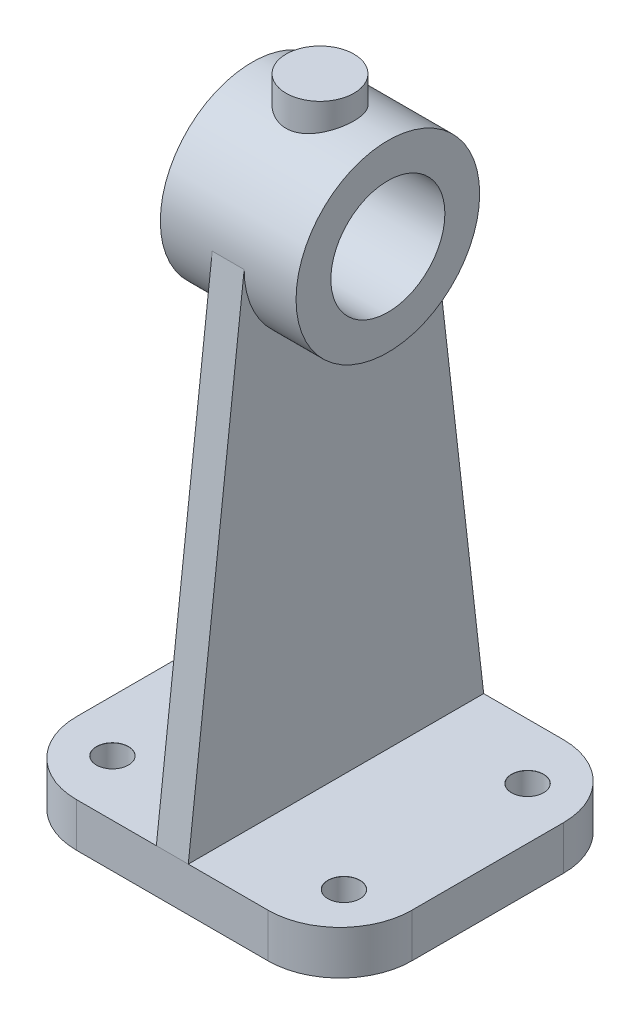
ISO-10303-21;
HEADER;
FILE_DESCRIPTION(('STEP AP214'),'2;1');
FILE_NAME('part.step','',(''),(''),'','','');
FILE_SCHEMA(('AUTOMOTIVE_DESIGN { 1 0 10303 214 1 1 1 1 }'));
ENDSEC;
DATA;
#1=APPLICATION_CONTEXT('core data for automotive mechanical design processes');
#2=APPLICATION_PROTOCOL_DEFINITION('international standard','automotive_design',2000,#1);
#3=PRODUCT_CONTEXT('',#1,'mechanical');
#4=PRODUCT('Part','Part','',(#3));
#5=PRODUCT_RELATED_PRODUCT_CATEGORY('part','',(#4));
#6=PRODUCT_DEFINITION_FORMATION('','',#4);
#7=PRODUCT_DEFINITION_CONTEXT('part definition',#1,'design');
#8=PRODUCT_DEFINITION('design','',#6,#7);
#9=PRODUCT_DEFINITION_SHAPE('','',#8);
#10=(LENGTH_UNIT() NAMED_UNIT(*) SI_UNIT(.MILLI.,.METRE.));
#11=(NAMED_UNIT(*) PLANE_ANGLE_UNIT() SI_UNIT($,.RADIAN.));
#12=(NAMED_UNIT(*) SI_UNIT($,.STERADIAN.) SOLID_ANGLE_UNIT());
#13=UNCERTAINTY_MEASURE_WITH_UNIT(LENGTH_MEASURE(1.E-05),#10,'distance_accuracy_value','');
#14=(GEOMETRIC_REPRESENTATION_CONTEXT(3) GLOBAL_UNCERTAINTY_ASSIGNED_CONTEXT((#13)) GLOBAL_UNIT_ASSIGNED_CONTEXT((#10,
#11,#12)) REPRESENTATION_CONTEXT('',''));
#15=CARTESIAN_POINT('',(0.,0.,0.));
#16=DIRECTION('',(0.,0.,1.));
#17=DIRECTION('',(1.,0.,0.));
#18=AXIS2_PLACEMENT_3D('',#15,#16,#17);
#19=CARTESIAN_POINT('',(17.,133.,0.));
#20=DIRECTION('',(-1.,0.,0.));
#21=DIRECTION('',(0.,0.,1.));
#22=AXIS2_PLACEMENT_3D('',#19,#20,#21);
#23=CYLINDRICAL_SURFACE('',#22,23.);
#24=CARTESIAN_POINT('',(4.,133.,0.));
#25=DIRECTION('',(1.,0.,0.));
#26=DIRECTION('',(0.,0.,-1.));
#27=AXIS2_PLACEMENT_3D('',#24,#25,#26);
#28=CIRCLE('',#27,23.);
#29=CARTESIAN_POINT('',(4.,133.,23.));
#30=VERTEX_POINT('',#29);
#31=CARTESIAN_POINT('',(4.,133.,-23.));
#32=VERTEX_POINT('',#31);
#33=EDGE_CURVE('E171',#30,#32,#28,.T.);
#34=ORIENTED_EDGE('',*,*,#33,.T.);
#35=DIRECTION('',(-1.,0.,0.));
#36=VECTOR('',#35,1.);
#37=CARTESIAN_POINT('',(4.,133.,-23.));
#38=LINE('',#37,#36);
#39=CARTESIAN_POINT('',(-4.,133.,-23.));
#40=VERTEX_POINT('',#39);
#41=EDGE_CURVE('E146',#32,#40,#38,.T.);
#42=ORIENTED_EDGE('',*,*,#41,.T.);
#43=CARTESIAN_POINT('',(-4.,133.,0.));
#44=DIRECTION('',(1.,0.,0.));
#45=DIRECTION('',(0.,0.,-1.));
#46=AXIS2_PLACEMENT_3D('',#43,#44,#45);
#47=CIRCLE('',#46,23.);
#48=CARTESIAN_POINT('',(-4.,133.,23.));
#49=VERTEX_POINT('',#48);
#50=EDGE_CURVE('E140',#49,#40,#47,.T.);
#51=ORIENTED_EDGE('',*,*,#50,.F.);
#52=DIRECTION('',(-1.,0.,0.));
#53=VECTOR('',#52,1.);
#54=CARTESIAN_POINT('',(4.,133.,23.));
#55=LINE('',#54,#53);
#56=EDGE_CURVE('E143',#30,#49,#55,.T.);
#57=ORIENTED_EDGE('',*,*,#56,.F.);
#58=EDGE_LOOP('',(#34,#42,#51,#57));
#59=FACE_BOUND('',#58,.T.);
#60=CARTESIAN_POINT('',(17.,133.,0.));
#61=DIRECTION('',(1.,0.,0.));
#62=DIRECTION('',(0.,0.,-1.));
#63=AXIS2_PLACEMENT_3D('',#60,#61,#62);
#64=CIRCLE('',#63,23.);
#65=CARTESIAN_POINT('',(17.,133.,-23.));
#66=VERTEX_POINT('',#65);
#67=EDGE_CURVE('E152',#66,#66,#64,.T.);
#68=ORIENTED_EDGE('',*,*,#67,.F.);
#69=EDGE_LOOP('',(#68));
#70=FACE_BOUND('',#69,.T.);
#71=CARTESIAN_POINT('',(-17.,133.,0.));
#72=DIRECTION('',(1.,0.,0.));
#73=DIRECTION('',(0.,0.,-1.));
#74=AXIS2_PLACEMENT_3D('',#71,#72,#73);
#75=CIRCLE('',#74,23.);
#76=CARTESIAN_POINT('',(-17.,133.,-23.));
#77=VERTEX_POINT('',#76);
#78=EDGE_CURVE('E302',#77,#77,#75,.T.);
#79=ORIENTED_EDGE('',*,*,#78,.T.);
#80=EDGE_LOOP('',(#79));
#81=FACE_BOUND('',#80,.T.);
#82=CARTESIAN_POINT('',(0.,154.371710273163,8.5));
#83=CARTESIAN_POINT('',(0.229775915866107,154.371709414959,8.50000095938498));
#84=CARTESIAN_POINT('',(0.459538674025617,154.375425831429,8.49067536109354));
#85=CARTESIAN_POINT('',(0.917322815176592,154.390164864719,8.45347561910277));
#86=CARTESIAN_POINT('',(1.14534421533403,154.401187409421,8.42560165848898));
#87=CARTESIAN_POINT('',(1.59793548188344,154.430174739107,8.35159764599628));
#88=CARTESIAN_POINT('',(1.82250554240052,154.44813913214,8.30546862482995));
#89=CARTESIAN_POINT('',(2.26662628933497,154.490433260763,8.19541016579389));
#90=CARTESIAN_POINT('',(2.48617684217598,154.514763165534,8.13148025481204));
#91=CARTESIAN_POINT('',(2.91823342636201,154.568965202636,7.98659500172839));
#92=CARTESIAN_POINT('',(3.13075615691292,154.598822887724,7.90568396897091));
#93=CARTESIAN_POINT('',(3.54811082311615,154.663253624277,7.72738149726256));
#94=CARTESIAN_POINT('',(3.75294004399929,154.69782832064,7.6299843064564));
#95=CARTESIAN_POINT('',(4.15362456302796,154.770709312278,7.41947535547076));
#96=CARTESIAN_POINT('',(4.34948090021479,154.809015173878,7.30636542094188));
#97=CARTESIAN_POINT('',(4.73124281765567,154.888347941446,7.06515004434444));
#98=CARTESIAN_POINT('',(4.91714476575472,154.929375828565,6.93703918234816));
#99=CARTESIAN_POINT('',(5.28583104538984,155.014914542455,6.66073201387198));
#100=CARTESIAN_POINT('',(5.46812403414775,155.059499222677,6.51190258518545));
#101=CARTESIAN_POINT('',(5.81967367744369,155.149259832301,6.19973078045039));
#102=CARTESIAN_POINT('',(5.98893001636298,155.194435775988,6.03638805323933));
#103=CARTESIAN_POINT('',(6.31346765651576,155.284199415527,5.69608873151632));
#104=CARTESIAN_POINT('',(6.46874367053101,155.328786883429,5.51912703298387));
#105=CARTESIAN_POINT('',(6.7642254840159,155.416173421023,5.15272975771495));
#106=CARTESIAN_POINT('',(6.90443649911829,155.458973106504,4.96329853490196));
#107=CARTESIAN_POINT('',(7.17332643701867,155.543064528384,4.56647860581622));
#108=CARTESIAN_POINT('',(7.3014636595574,155.584258129724,4.35870141242079));
#109=CARTESIAN_POINT('',(7.53963798598468,155.662380397981,3.93236015761444));
#110=CARTESIAN_POINT('',(7.64968233954887,155.699310771367,3.71380046253266));
#111=CARTESIAN_POINT('',(7.85077223080252,155.767865212504,3.26731034594423));
#112=CARTESIAN_POINT('',(7.94181863139777,155.799489521249,3.03938035060902));
#113=CARTESIAN_POINT('',(8.10404505009427,155.856503965761,2.57580074316979));
#114=CARTESIAN_POINT('',(8.1752261334322,155.881894435795,2.34015154574951));
#115=CARTESIAN_POINT('',(8.29443151750516,155.924760291081,1.87298072998978));
#116=CARTESIAN_POINT('',(8.34330291851102,155.942523347641,1.64170151041939));
#117=CARTESIAN_POINT('',(8.42164927965232,155.971130636843,1.1754562405086));
#118=CARTESIAN_POINT('',(8.45112473549612,155.981975046308,0.940490284548438));
#119=CARTESIAN_POINT('',(8.4903632098741,155.996433079812,0.468759942126706));
#120=CARTESIAN_POINT('',(8.50013155339173,156.000048657125,0.231996058837068));
#121=CARTESIAN_POINT('',(8.49986578119347,155.999950357832,-0.241515741267165));
#122=CARTESIAN_POINT('',(8.4898322444726,155.996236695528,-0.478263658346189));
#123=CARTESIAN_POINT('',(8.45103594608556,155.981943058481,-0.938463189494859));
#124=CARTESIAN_POINT('',(8.42320179379548,155.971703603176,-1.16200442573995));
#125=CARTESIAN_POINT('',(8.34995470075081,155.94494674058,-1.6058866875009));
#126=CARTESIAN_POINT('',(8.30453557702733,155.928427125189,-1.82622655909655));
#127=CARTESIAN_POINT('',(8.1965547647133,155.889538592229,-2.26205150627969));
#128=CARTESIAN_POINT('',(8.13399883676114,155.867171640392,-2.47753818699966));
#129=CARTESIAN_POINT('',(7.99225429646033,155.817136826727,-2.90242091066315));
#130=CARTESIAN_POINT('',(7.91305938446155,155.789466957522,-3.11181461247401));
#131=CARTESIAN_POINT('',(7.73746806545198,155.729089788099,-3.52603145185157));
#132=CARTESIAN_POINT('',(7.64084618487887,155.696317337405,-3.73074943857737));
#133=CARTESIAN_POINT('',(7.43187652042364,155.626822114239,-4.13137688051776));
#134=CARTESIAN_POINT('',(7.319523372949,155.590097995435,-4.32728330119288));
#135=CARTESIAN_POINT('',(7.079891753328,155.513595378714,-4.70913435312721));
#136=CARTESIAN_POINT('',(6.95261202780597,155.473816624399,-4.89507814591801));
#137=CARTESIAN_POINT('',(6.68394704833021,155.392158718158,-5.25599354940185));
#138=CARTESIAN_POINT('',(6.54256115994075,155.350279471803,-5.4309646660133));
#139=CARTESIAN_POINT('',(6.23804757903824,155.262990912065,-5.77868318946364));
#140=CARTESIAN_POINT('',(6.07413887835063,155.217516694019,-5.95073104648789));
#141=CARTESIAN_POINT('',(5.73255727742082,155.126570556833,-6.28045556351158));
#142=CARTESIAN_POINT('',(5.55488855476436,155.081098641156,-6.43813655393984));
#143=CARTESIAN_POINT('',(5.18667841878683,154.99135603358,-6.73830981719282));
#144=CARTESIAN_POINT('',(4.99612930229291,154.947086083102,-6.8807928671531));
#145=CARTESIAN_POINT('',(4.60344705997251,154.861039491115,-7.14946492356397));
#146=CARTESIAN_POINT('',(4.40131849026021,154.819261881986,-7.27566027594099));
#147=CARTESIAN_POINT('',(3.98214497064019,154.738543859382,-7.51344268919522));
#148=CARTESIAN_POINT('',(3.76487257665985,154.699683888351,-7.62465677147438));
#149=CARTESIAN_POINT('',(3.32094242834558,154.627083522516,-7.82821434456089));
#150=CARTESIAN_POINT('',(3.09428870581085,154.593340956906,-7.9205658426903));
#151=CARTESIAN_POINT('',(2.63314898815616,154.532098664392,-8.08557227573551));
#152=CARTESIAN_POINT('',(2.39866471216818,154.504597577428,-8.15823150240587));
#153=CARTESIAN_POINT('',(1.92360019814951,154.456803400177,-8.28311959920727));
#154=CARTESIAN_POINT('',(1.68302036518413,154.436509832271,-8.33534982312593));
#155=CARTESIAN_POINT('',(1.21079296303975,154.404755163416,-8.41654618212832));
#156=CARTESIAN_POINT('',(0.979362462448499,154.392877112745,-8.44661407882));
#157=CARTESIAN_POINT('',(0.514551332068469,154.376642155406,-8.48761816167527));
#158=CARTESIAN_POINT('',(0.281170772775786,154.372284978025,-8.49855503645895));
#159=CARTESIAN_POINT('',(-0.185664691933814,154.371242267751,-8.50117668465825));
#160=CARTESIAN_POINT('',(-0.41911957120935,154.374555113495,-8.49286552690541));
#161=CARTESIAN_POINT('',(-0.884321689379734,154.388734740396,-8.45709143116048));
#162=CARTESIAN_POINT('',(-1.11606895948026,154.399601383163,-8.42962884403246));
#163=CARTESIAN_POINT('',(-1.56552390983119,154.427852795569,-8.35754402620752));
#164=CARTESIAN_POINT('',(-1.78338810549485,154.444915848886,-8.3137663398075));
#165=CARTESIAN_POINT('',(-2.21457286403258,154.48507008072,-8.20943880000196));
#166=CARTESIAN_POINT('',(-2.42789180632777,154.508163371628,-8.14888306879957));
#167=CARTESIAN_POINT('',(-2.84851561930423,154.559695587502,-8.0115477633183));
#168=CARTESIAN_POINT('',(-3.05582182178693,154.588133318094,-7.93477181345912));
#169=CARTESIAN_POINT('',(-3.46333062998914,154.649574168315,-7.7655673969148));
#170=CARTESIAN_POINT('',(-3.66353043954713,154.682579060509,-7.67313284981487));
#171=CARTESIAN_POINT('',(-4.06277303719396,154.753531676179,-7.46966406893017));
#172=CARTESIAN_POINT('',(-4.26150934580644,154.791615444177,-7.35807595312031));
#173=CARTESIAN_POINT('',(-4.64905483872566,154.870704169791,-7.11955665470747));
#174=CARTESIAN_POINT('',(-4.83785955241217,154.911710423706,-6.9926186458761));
#175=CARTESIAN_POINT('',(-5.20444999067684,154.995555272972,-6.72423299876731));
#176=CARTESIAN_POINT('',(-5.3822347107114,155.038394034768,-6.58278404083438));
#177=CARTESIAN_POINT('',(-5.72581954464736,155.124813155634,-6.28621478037363));
#178=CARTESIAN_POINT('',(-5.89161928369005,155.168393537846,-6.13109405056519));
#179=CARTESIAN_POINT('',(-6.22013942610391,155.257889330419,-5.79809264750484));
#180=CARTESIAN_POINT('',(-6.38204266613803,155.303783424399,-5.61939883538075));
#181=CARTESIAN_POINT('',(-6.69021494941231,155.393911361465,-5.24872339613047));
#182=CARTESIAN_POINT('',(-6.83648948454091,155.438145784186,-5.05674647598532));
#183=CARTESIAN_POINT('',(-7.11251137871586,155.523778385911,-4.66052551394389));
#184=CARTESIAN_POINT('',(-7.24225160407136,155.565175337159,-4.45627623271158));
#185=CARTESIAN_POINT('',(-7.48408487453723,155.643949694014,-4.03695718762298));
#186=CARTESIAN_POINT('',(-7.5961854631709,155.68132881565,-3.82189210131268));
#187=CARTESIAN_POINT('',(-7.80147534206775,155.750905976093,-3.38310911880484));
#188=CARTESIAN_POINT('',(-7.89473408625512,155.783122948952,-3.15942675918575));
#189=CARTESIAN_POINT('',(-8.06201027077814,155.841625713104,-2.7042162657834));
#190=CARTESIAN_POINT('',(-8.13602762465575,155.867911477744,-2.47268809675157));
#191=CARTESIAN_POINT('',(-8.26405820246302,155.913774983212,-2.00360332369814));
#192=CARTESIAN_POINT('',(-8.31807893239402,155.933355240835,-1.76604901751887));
#193=CARTESIAN_POINT('',(-8.40557715187142,155.965235944794,-1.28670828960512));
#194=CARTESIAN_POINT('',(-8.43905578083266,155.977536794898,-1.04492210336689));
#195=CARTESIAN_POINT('',(-8.48379241371634,155.99400645446,-0.572916057044091));
#196=CARTESIAN_POINT('',(-8.49620494161708,155.998597625538,-0.342819637583203));
#197=CARTESIAN_POINT('',(-8.50230378039103,156.000851270861,0.117650305227534));
#198=CARTESIAN_POINT('',(-8.49599084468428,155.998514023871,0.348023817055761));
#199=CARTESIAN_POINT('',(-8.46470579584663,155.9869753237,0.80729841868431));
#200=CARTESIAN_POINT('',(-8.43973572050229,155.977774620165,1.03619966653584));
#201=CARTESIAN_POINT('',(-8.37138939021792,155.952759096398,1.4908683008366));
#202=CARTESIAN_POINT('',(-8.32801313817222,155.936944277205,1.71663568777863));
#203=CARTESIAN_POINT('',(-8.22450170234715,155.899566781087,2.15819089386682));
#204=CARTESIAN_POINT('',(-8.16478240073736,155.878147253949,2.37408861458024));
#205=CARTESIAN_POINT('',(-8.028687773494,155.8299316412,2.80003196030865));
#206=CARTESIAN_POINT('',(-7.95230653515589,155.80313364724,3.01007547796714));
#207=CARTESIAN_POINT('',(-7.78354232485212,155.744829417638,3.42289122948837));
#208=CARTESIAN_POINT('',(-7.69116304654747,155.713324269024,3.62566512876065));
#209=CARTESIAN_POINT('',(-7.49104766512324,155.646344183195,4.02289538396114));
#210=CARTESIAN_POINT('',(-7.38330563110801,155.610867713968,4.21734848972158));
#211=CARTESIAN_POINT('',(-7.1485058378333,155.535267499221,4.60458657673742));
#212=CARTESIAN_POINT('',(-7.02083669622064,155.495012759824,4.79697536056817));
#213=CARTESIAN_POINT('',(-6.75049854232737,155.412109996516,5.17048799587724));
#214=CARTESIAN_POINT('',(-6.60782277064222,155.369460898186,5.35160671203789));
#215=CARTESIAN_POINT('',(-6.30839773850786,155.282848697676,5.70150360860232));
#216=CARTESIAN_POINT('',(-6.1516471115846,155.238885468189,5.87028058790154));
#217=CARTESIAN_POINT('',(-5.82500149242498,155.15075422157,6.19453968495063));
#218=CARTESIAN_POINT('',(-5.65510621943205,155.106586200084,6.35002151858));
#219=CARTESIAN_POINT('',(-5.29410353924634,155.016934954024,6.65439865345492));
#220=CARTESIAN_POINT('',(-5.10235550886028,154.971500117912,6.80254953768143));
#221=CARTESIAN_POINT('',(-4.70662105897265,154.882986782527,7.08211749826815));
#222=CARTESIAN_POINT('',(-4.50263920924614,154.839907414755,7.21354076642744));
#223=CARTESIAN_POINT('',(-4.08351802059839,154.757364242979,7.45881092083367));
#224=CARTESIAN_POINT('',(-3.86837308256336,154.717902281368,7.57264887064381));
#225=CARTESIAN_POINT('',(-3.42850791453102,154.643883570653,7.78168366862904));
#226=CARTESIAN_POINT('',(-3.20379184973344,154.60932471559,7.87688852671111));
#227=CARTESIAN_POINT('',(-2.73894885169079,154.545236067988,8.05056867429209));
#228=CARTESIAN_POINT('',(-2.49855903632515,154.515901528118,8.12841448682996));
#229=CARTESIAN_POINT('',(-2.011037198999,154.464750609927,8.26254466125439));
#230=CARTESIAN_POINT('',(-1.76390495105785,154.442934483929,8.3188282995057));
#231=CARTESIAN_POINT('',(-1.26514267142371,154.407679624544,8.40913841853193));
#232=CARTESIAN_POINT('',(-1.01351502681963,154.394236573471,8.44317637103218));
#233=CARTESIAN_POINT('',(-0.50791940623453,154.376252817548,8.4886054982438));
#234=CARTESIAN_POINT('',(-0.253951667054378,154.371711221661,8.49999893967384));
#235=CARTESIAN_POINT('',(0.,154.371710273163,8.5));
#236=B_SPLINE_CURVE_WITH_KNOTS('',3,(#82,#83,#84,#85,#86,#87,#88,#89,#90,#91,#92,#93,#94,#95,
#96,#97,#98,#99,#100,#101,#102,#103,#104,#105,#106,#107,#108,#109,#110,#111,#112,#113,#114,#115,
#116,#117,#118,#119,#120,#121,#122,#123,#124,#125,#126,#127,#128,#129,#130,#131,#132,#133,#134,
#135,#136,#137,#138,#139,#140,#141,#142,#143,#144,#145,#146,#147,#148,#149,#150,#151,#152,#153,
#154,#155,#156,#157,#158,#159,#160,#161,#162,#163,#164,#165,#166,#167,#168,#169,#170,#171,#172,
#173,#174,#175,#176,#177,#178,#179,#180,#181,#182,#183,#184,#185,#186,#187,#188,#189,#190,#191,
#192,#193,#194,#195,#196,#197,#198,#199,#200,#201,#202,#203,#204,#205,#206,#207,#208,#209,#210,
#211,#212,#213,#214,#215,#216,#217,#218,#219,#220,#221,#222,#223,#224,#225,#226,#227,#228,#229,
#230,#231,#232,#233,#234,#235),.UNSPECIFIED.,.T.,.F.,(4,2,2,2,2,2,2,2,2,2,2,2,2,2,2,2,2,2,2,2,2,
2,2,2,2,2,2,2,2,2,2,2,2,2,2,2,2,2,2,2,2,2,2,2,2,2,2,2,2,2,2,2,2,2,2,2,2,2,2,2,2,2,2,2,2,2,2,2,2,
2,2,2,2,2,2,2,4),(0.,0.689087155997459,1.37816751031509,2.06720896350271,2.75626873178511,
3.44355238590793,4.1310763225247,4.81852044301835,5.50621371220448,6.22396229654485,
6.94172825220005,7.65976452939804,8.37755140974377,9.11931630708278,9.86078325664537,
10.6022165207118,11.3436100193054,12.0538615884382,12.7640950047398,13.4741364858687,
14.1841572061206,14.8598629958209,15.5358065833217,16.2115232266113,16.8874961640405,
17.5729406103853,18.2586193314371,18.9443556697944,19.6301228635957,20.3551121208858,
21.0798821255766,21.8050894839128,22.5300134323381,23.2705437409756,24.0107590320299,
24.7508128698127,25.4908176574507,26.1909543572292,26.8910658551072,27.5910293702907,
28.2909800621185,28.9588365147075,29.6269272317129,30.2948688209569,30.9630703767092,
31.6555565178954,32.3483517539976,33.0412100502662,33.7340900079531,34.4696023914346,
35.2048554617052,35.9404246889853,36.6756784929531,37.4081704984638,38.1406657952503,
38.8728858606054,39.605065308019,40.2956409582329,40.9861888234751,41.6766612761123,
42.3671336201736,43.0414499379135,43.7160059359496,44.390406398216,45.0650679258197,
45.7674261264821,46.4701020547677,47.1728462770953,47.8756055134863,48.6143335403337,
49.3527873236424,50.0916151456242,50.8301246627535,51.5921577248751,52.3542163588931,
53.1158817013837,53.8774707972282),.UNSPECIFIED.);
#237=CARTESIAN_POINT('',(0.,154.371710273163,8.5));
#238=VERTEX_POINT('',#237);
#239=EDGE_CURVE('E11',#238,#238,#236,.T.);
#240=ORIENTED_EDGE('',*,*,#239,.F.);
#241=EDGE_LOOP('',(#240));
#242=FACE_BOUND('',#241,.T.);
#243=ADVANCED_FACE('F45',(#59,#70,#81,#242),#23,.T.);
#244=CARTESIAN_POINT('',(0.,11.,0.));
#245=DIRECTION('',(0.,1.,0.));
#246=DIRECTION('',(0.,0.,1.));
#247=AXIS2_PLACEMENT_3D('',#244,#245,#246);
#248=PLANE('',#247);
#249=CARTESIAN_POINT('',(-29.,11.,23.));
#250=DIRECTION('',(0.,1.,0.));
#251=DIRECTION('',(0.,0.,1.));
#252=AXIS2_PLACEMENT_3D('',#249,#250,#251);
#253=CIRCLE('',#252,4.025);
#254=CARTESIAN_POINT('',(-29.,11.,27.025));
#255=VERTEX_POINT('',#254);
#256=EDGE_CURVE('E204',#255,#255,#253,.T.);
#257=ORIENTED_EDGE('',*,*,#256,.F.);
#258=EDGE_LOOP('',(#257));
#259=FACE_BOUND('',#258,.T.);
#260=CARTESIAN_POINT('',(-29.,11.,-23.));
#261=DIRECTION('',(0.,1.,0.));
#262=DIRECTION('',(0.,0.,1.));
#263=AXIS2_PLACEMENT_3D('',#260,#261,#262);
#264=CIRCLE('',#263,4.025);
#265=CARTESIAN_POINT('',(-29.,11.,-18.975));
#266=VERTEX_POINT('',#265);
#267=EDGE_CURVE('E195',#266,#266,#264,.T.);
#268=ORIENTED_EDGE('',*,*,#267,.F.);
#269=EDGE_LOOP('',(#268));
#270=FACE_BOUND('',#269,.T.);
#271=DIRECTION('',(1.,0.,0.));
#272=VECTOR('',#271,1.);
#273=CARTESIAN_POINT('',(-42.,11.,37.));
#274=LINE('',#273,#272);
#275=CARTESIAN_POINT('',(-24.,11.,37.));
#276=VERTEX_POINT('',#275);
#277=CARTESIAN_POINT('',(-4.00000000000002,11.,37.));
#278=VERTEX_POINT('',#277);
#279=EDGE_CURVE('E214',#276,#278,#274,.T.);
#280=ORIENTED_EDGE('',*,*,#279,.T.);
#281=DIRECTION('',(0.,0.,-1.));
#282=VECTOR('',#281,1.);
#283=CARTESIAN_POINT('',(-4.,11.,0.));
#284=LINE('',#283,#282);
#285=CARTESIAN_POINT('',(-4.00000000000002,11.,-37.));
#286=VERTEX_POINT('',#285);
#287=EDGE_CURVE('E164',#278,#286,#284,.T.);
#288=ORIENTED_EDGE('',*,*,#287,.T.);
#289=DIRECTION('',(1.,0.,0.));
#290=VECTOR('',#289,1.);
#291=CARTESIAN_POINT('',(-42.,11.,-37.));
#292=LINE('',#291,#290);
#293=CARTESIAN_POINT('',(-24.,11.,-37.));
#294=VERTEX_POINT('',#293);
#295=EDGE_CURVE('E221',#294,#286,#292,.T.);
#296=ORIENTED_EDGE('',*,*,#295,.F.);
#297=CARTESIAN_POINT('',(-24.,11.,-19.));
#298=DIRECTION('',(0.,1.,0.));
#299=DIRECTION('',(0.,0.,1.));
#300=AXIS2_PLACEMENT_3D('',#297,#298,#299);
#301=CIRCLE('',#300,18.);
#302=CARTESIAN_POINT('',(-42.,11.,-19.));
#303=VERTEX_POINT('',#302);
#304=EDGE_CURVE('E263',#294,#303,#301,.T.);
#305=ORIENTED_EDGE('',*,*,#304,.T.);
#306=DIRECTION('',(0.,0.,-1.));
#307=VECTOR('',#306,1.);
#308=CARTESIAN_POINT('',(-42.,11.,37.));
#309=LINE('',#308,#307);
#310=CARTESIAN_POINT('',(-42.,11.,19.));
#311=VERTEX_POINT('',#310);
#312=EDGE_CURVE('E224',#311,#303,#309,.T.);
#313=ORIENTED_EDGE('',*,*,#312,.F.);
#314=CARTESIAN_POINT('',(-24.,11.,19.));
#315=DIRECTION('',(0.,1.,0.));
#316=DIRECTION('',(0.,0.,1.));
#317=AXIS2_PLACEMENT_3D('',#314,#315,#316);
#318=CIRCLE('',#317,18.);
#319=EDGE_CURVE('E256',#311,#276,#318,.T.);
#320=ORIENTED_EDGE('',*,*,#319,.T.);
#321=EDGE_LOOP('',(#280,#288,#296,#305,#313,#320));
#322=FACE_BOUND('',#321,.T.);
#323=ADVANCED_FACE('F332',(#259,#270,#322),#248,.T.);
#324=CARTESIAN_POINT('',(-42.,11.,37.));
#325=DIRECTION('',(0.,0.,-1.));
#326=DIRECTION('',(-1.,0.,0.));
#327=AXIS2_PLACEMENT_3D('',#324,#325,#326);
#328=PLANE('',#327);
#329=DIRECTION('',(1.,0.,0.));
#330=VECTOR('',#329,1.);
#331=CARTESIAN_POINT('',(-42.,0.,37.));
#332=LINE('',#331,#330);
#333=CARTESIAN_POINT('',(-24.,0.,37.));
#334=VERTEX_POINT('',#333);
#335=CARTESIAN_POINT('',(24.,0.,37.));
#336=VERTEX_POINT('',#335);
#337=EDGE_CURVE('E213',#334,#336,#332,.T.);
#338=ORIENTED_EDGE('',*,*,#337,.T.);
#339=DIRECTION('',(0.,-1.,0.));
#340=VECTOR('',#339,1.);
#341=CARTESIAN_POINT('',(24.,11.,37.));
#342=LINE('',#341,#340);
#343=CARTESIAN_POINT('',(24.,11.,37.));
#344=VERTEX_POINT('',#343);
#345=EDGE_CURVE('E58',#336,#344,#342,.F.);
#346=ORIENTED_EDGE('',*,*,#345,.T.);
#347=CARTESIAN_POINT('',(3.99999999999999,11.,37.));
#348=VERTEX_POINT('',#347);
#349=EDGE_CURVE('E217',#348,#344,#274,.T.);
#350=ORIENTED_EDGE('',*,*,#349,.F.);
#351=DIRECTION('',(-1.,0.,0.));
#352=VECTOR('',#351,1.);
#353=CARTESIAN_POINT('',(4.,11.,37.));
#354=LINE('',#353,#352);
#355=EDGE_CURVE('E72',#348,#278,#354,.T.);
#356=ORIENTED_EDGE('',*,*,#355,.T.);
#357=ORIENTED_EDGE('',*,*,#279,.F.);
#358=DIRECTION('',(0.,-1.,0.));
#359=VECTOR('',#358,1.);
#360=CARTESIAN_POINT('',(-24.,0.,37.));
#361=LINE('',#360,#359);
#362=EDGE_CURVE('E270',#276,#334,#361,.T.);
#363=ORIENTED_EDGE('',*,*,#362,.T.);
#364=EDGE_LOOP('',(#338,#346,#350,#356,#357,#363));
#365=FACE_BOUND('',#364,.T.);
#366=ADVANCED_FACE('F275',(#365),#328,.F.);
#367=CARTESIAN_POINT('',(42.,11.,37.));
#368=DIRECTION('',(-1.,0.,0.));
#369=DIRECTION('',(0.,0.,1.));
#370=AXIS2_PLACEMENT_3D('',#367,#368,#369);
#371=PLANE('',#370);
#372=DIRECTION('',(0.,0.,-1.));
#373=VECTOR('',#372,1.);
#374=CARTESIAN_POINT('',(42.,0.,37.));
#375=LINE('',#374,#373);
#376=CARTESIAN_POINT('',(42.,0.,19.));
#377=VERTEX_POINT('',#376);
#378=CARTESIAN_POINT('',(42.,0.,-19.));
#379=VERTEX_POINT('',#378);
#380=EDGE_CURVE('E230',#377,#379,#375,.T.);
#381=ORIENTED_EDGE('',*,*,#380,.T.);
#382=DIRECTION('',(0.,-1.,0.));
#383=VECTOR('',#382,1.);
#384=CARTESIAN_POINT('',(42.,11.,-19.));
#385=LINE('',#384,#383);
#386=CARTESIAN_POINT('',(42.,11.,-19.));
#387=VERTEX_POINT('',#386);
#388=EDGE_CURVE('E268',#379,#387,#385,.F.);
#389=ORIENTED_EDGE('',*,*,#388,.T.);
#390=DIRECTION('',(0.,0.,-1.));
#391=VECTOR('',#390,1.);
#392=CARTESIAN_POINT('',(42.,11.,37.));
#393=LINE('',#392,#391);
#394=CARTESIAN_POINT('',(42.,11.,19.));
#395=VERTEX_POINT('',#394);
#396=EDGE_CURVE('E216',#395,#387,#393,.T.);
#397=ORIENTED_EDGE('',*,*,#396,.F.);
#398=DIRECTION('',(0.,-1.,0.));
#399=VECTOR('',#398,1.);
#400=CARTESIAN_POINT('',(42.,11.,19.));
#401=LINE('',#400,#399);
#402=EDGE_CURVE('E265',#395,#377,#401,.T.);
#403=ORIENTED_EDGE('',*,*,#402,.T.);
#404=EDGE_LOOP('',(#381,#389,#397,#403));
#405=FACE_BOUND('',#404,.T.);
#406=ADVANCED_FACE('F285',(#405),#371,.F.);
#407=CARTESIAN_POINT('',(-42.,11.,-37.));
#408=DIRECTION('',(0.,0.,-1.));
#409=DIRECTION('',(-1.,0.,0.));
#410=AXIS2_PLACEMENT_3D('',#407,#408,#409);
#411=PLANE('',#410);
#412=DIRECTION('',(1.,0.,0.));
#413=VECTOR('',#412,1.);
#414=CARTESIAN_POINT('',(-42.,0.,-37.));
#415=LINE('',#414,#413);
#416=CARTESIAN_POINT('',(-24.,0.,-37.));
#417=VERTEX_POINT('',#416);
#418=CARTESIAN_POINT('',(24.,0.,-37.));
#419=VERTEX_POINT('',#418);
#420=EDGE_CURVE('E233',#417,#419,#415,.T.);
#421=ORIENTED_EDGE('',*,*,#420,.F.);
#422=DIRECTION('',(0.,-1.,0.));
#423=VECTOR('',#422,1.);
#424=CARTESIAN_POINT('',(-24.,11.,-37.));
#425=LINE('',#424,#423);
#426=EDGE_CURVE('E254',#417,#294,#425,.F.);
#427=ORIENTED_EDGE('',*,*,#426,.T.);
#428=ORIENTED_EDGE('',*,*,#295,.T.);
#429=DIRECTION('',(-1.,0.,0.));
#430=VECTOR('',#429,1.);
#431=CARTESIAN_POINT('',(4.,11.,-37.));
#432=LINE('',#431,#430);
#433=CARTESIAN_POINT('',(4.,11.,-37.));
#434=VERTEX_POINT('',#433);
#435=EDGE_CURVE('E173',#434,#286,#432,.T.);
#436=ORIENTED_EDGE('',*,*,#435,.F.);
#437=CARTESIAN_POINT('',(24.,11.,-37.));
#438=VERTEX_POINT('',#437);
#439=EDGE_CURVE('E220',#434,#438,#292,.T.);
#440=ORIENTED_EDGE('',*,*,#439,.T.);
#441=DIRECTION('',(0.,-1.,0.));
#442=VECTOR('',#441,1.);
#443=CARTESIAN_POINT('',(24.,0.,-37.));
#444=LINE('',#443,#442);
#445=EDGE_CURVE('E251',#438,#419,#444,.T.);
#446=ORIENTED_EDGE('',*,*,#445,.T.);
#447=EDGE_LOOP('',(#421,#427,#428,#436,#440,#446));
#448=FACE_BOUND('',#447,.T.);
#449=ADVANCED_FACE('F392',(#448),#411,.T.);
#450=CARTESIAN_POINT('',(-42.,11.,37.));
#451=DIRECTION('',(-1.,0.,0.));
#452=DIRECTION('',(0.,0.,1.));
#453=AXIS2_PLACEMENT_3D('',#450,#451,#452);
#454=PLANE('',#453);
#455=ORIENTED_EDGE('',*,*,#312,.T.);
#456=DIRECTION('',(0.,-1.,0.));
#457=VECTOR('',#456,1.);
#458=CARTESIAN_POINT('',(-42.,11.,-19.));
#459=LINE('',#458,#457);
#460=CARTESIAN_POINT('',(-42.,0.,-19.));
#461=VERTEX_POINT('',#460);
#462=EDGE_CURVE('E240',#303,#461,#459,.T.);
#463=ORIENTED_EDGE('',*,*,#462,.T.);
#464=DIRECTION('',(0.,0.,-1.));
#465=VECTOR('',#464,1.);
#466=CARTESIAN_POINT('',(-42.,0.,37.));
#467=LINE('',#466,#465);
#468=CARTESIAN_POINT('',(-42.,0.,19.));
#469=VERTEX_POINT('',#468);
#470=EDGE_CURVE('E236',#469,#461,#467,.T.);
#471=ORIENTED_EDGE('',*,*,#470,.F.);
#472=DIRECTION('',(0.,-1.,0.));
#473=VECTOR('',#472,1.);
#474=CARTESIAN_POINT('',(-42.,11.,19.));
#475=LINE('',#474,#473);
#476=EDGE_CURVE('E227',#469,#311,#475,.F.);
#477=ORIENTED_EDGE('',*,*,#476,.T.);
#478=EDGE_LOOP('',(#455,#463,#471,#477));
#479=FACE_BOUND('',#478,.T.);
#480=ADVANCED_FACE('F385',(#479),#454,.T.);
#481=DIRECTION('',(0.,0.,-1.));
#482=VECTOR('',#481,1.);
#483=CARTESIAN_POINT('',(4.,11.,0.));
#484=LINE('',#483,#482);
#485=EDGE_CURVE('E65',#348,#434,#484,.T.);
#486=ORIENTED_EDGE('',*,*,#485,.F.);
#487=ORIENTED_EDGE('',*,*,#349,.T.);
#488=CARTESIAN_POINT('',(24.,11.,19.));
#489=DIRECTION('',(0.,1.,0.));
#490=DIRECTION('',(0.,0.,1.));
#491=AXIS2_PLACEMENT_3D('',#488,#489,#490);
#492=CIRCLE('',#491,18.);
#493=EDGE_CURVE('E258',#344,#395,#492,.T.);
#494=ORIENTED_EDGE('',*,*,#493,.T.);
#495=ORIENTED_EDGE('',*,*,#396,.T.);
#496=CARTESIAN_POINT('',(24.,11.,-19.));
#497=DIRECTION('',(0.,1.,0.));
#498=DIRECTION('',(0.,0.,1.));
#499=AXIS2_PLACEMENT_3D('',#496,#497,#498);
#500=CIRCLE('',#499,18.);
#501=EDGE_CURVE('E260',#387,#438,#500,.T.);
#502=ORIENTED_EDGE('',*,*,#501,.T.);
#503=ORIENTED_EDGE('',*,*,#439,.F.);
#504=EDGE_LOOP('',(#486,#487,#494,#495,#502,#503));
#505=FACE_BOUND('',#504,.T.);
#506=CARTESIAN_POINT('',(29.,11.,-23.));
#507=DIRECTION('',(0.,1.,0.));
#508=DIRECTION('',(0.,0.,1.));
#509=AXIS2_PLACEMENT_3D('',#506,#507,#508);
#510=CIRCLE('',#509,4.025);
#511=CARTESIAN_POINT('',(29.,11.,-18.975));
#512=VERTEX_POINT('',#511);
#513=EDGE_CURVE('E160',#512,#512,#510,.T.);
#514=ORIENTED_EDGE('',*,*,#513,.F.);
#515=EDGE_LOOP('',(#514));
#516=FACE_BOUND('',#515,.T.);
#517=CARTESIAN_POINT('',(29.,11.,23.));
#518=DIRECTION('',(0.,1.,0.));
#519=DIRECTION('',(0.,0.,1.));
#520=AXIS2_PLACEMENT_3D('',#517,#518,#519);
#521=CIRCLE('',#520,4.025);
#522=CARTESIAN_POINT('',(29.,11.,27.025));
#523=VERTEX_POINT('',#522);
#524=EDGE_CURVE('E186',#523,#523,#521,.T.);
#525=ORIENTED_EDGE('',*,*,#524,.F.);
#526=EDGE_LOOP('',(#525));
#527=FACE_BOUND('',#526,.T.);
#528=ADVANCED_FACE('F281',(#505,#516,#527),#248,.T.);
#529=CARTESIAN_POINT('',(0.,0.,0.));
#530=DIRECTION('',(0.,1.,0.));
#531=DIRECTION('',(0.,0.,1.));
#532=AXIS2_PLACEMENT_3D('',#529,#530,#531);
#533=PLANE('',#532);
#534=CARTESIAN_POINT('',(29.,0.,-23.));
#535=DIRECTION('',(0.,1.,0.));
#536=DIRECTION('',(0.,0.,1.));
#537=AXIS2_PLACEMENT_3D('',#534,#535,#536);
#538=CIRCLE('',#537,4.);
#539=CARTESIAN_POINT('',(29.,0.,-19.));
#540=VERTEX_POINT('',#539);
#541=EDGE_CURVE('E183',#540,#540,#538,.T.);
#542=ORIENTED_EDGE('',*,*,#541,.T.);
#543=EDGE_LOOP('',(#542));
#544=FACE_BOUND('',#543,.T.);
#545=CARTESIAN_POINT('',(29.,0.,23.));
#546=DIRECTION('',(0.,1.,0.));
#547=DIRECTION('',(0.,0.,1.));
#548=AXIS2_PLACEMENT_3D('',#545,#546,#547);
#549=CIRCLE('',#548,4.);
#550=CARTESIAN_POINT('',(29.,0.,27.));
#551=VERTEX_POINT('',#550);
#552=EDGE_CURVE('E192',#551,#551,#549,.T.);
#553=ORIENTED_EDGE('',*,*,#552,.T.);
#554=EDGE_LOOP('',(#553));
#555=FACE_BOUND('',#554,.T.);
#556=CARTESIAN_POINT('',(-29.,0.,-23.));
#557=DIRECTION('',(0.,1.,0.));
#558=DIRECTION('',(0.,0.,1.));
#559=AXIS2_PLACEMENT_3D('',#556,#557,#558);
#560=CIRCLE('',#559,4.);
#561=CARTESIAN_POINT('',(-29.,0.,-19.));
#562=VERTEX_POINT('',#561);
#563=EDGE_CURVE('E201',#562,#562,#560,.T.);
#564=ORIENTED_EDGE('',*,*,#563,.T.);
#565=EDGE_LOOP('',(#564));
#566=FACE_BOUND('',#565,.T.);
#567=CARTESIAN_POINT('',(-29.,0.,23.));
#568=DIRECTION('',(0.,1.,0.));
#569=DIRECTION('',(0.,0.,1.));
#570=AXIS2_PLACEMENT_3D('',#567,#568,#569);
#571=CIRCLE('',#570,4.);
#572=CARTESIAN_POINT('',(-29.,0.,27.));
#573=VERTEX_POINT('',#572);
#574=EDGE_CURVE('E210',#573,#573,#571,.T.);
#575=ORIENTED_EDGE('',*,*,#574,.T.);
#576=EDGE_LOOP('',(#575));
#577=FACE_BOUND('',#576,.T.);
#578=ORIENTED_EDGE('',*,*,#470,.T.);
#579=CARTESIAN_POINT('',(-24.,0.,-19.));
#580=DIRECTION('',(0.,1.,0.));
#581=DIRECTION('',(0.,0.,1.));
#582=AXIS2_PLACEMENT_3D('',#579,#580,#581);
#583=CIRCLE('',#582,18.);
#584=EDGE_CURVE('E249',#461,#417,#583,.F.);
#585=ORIENTED_EDGE('',*,*,#584,.T.);
#586=ORIENTED_EDGE('',*,*,#420,.T.);
#587=CARTESIAN_POINT('',(24.,0.,-19.));
#588=DIRECTION('',(0.,1.,0.));
#589=DIRECTION('',(0.,0.,1.));
#590=AXIS2_PLACEMENT_3D('',#587,#588,#589);
#591=CIRCLE('',#590,18.);
#592=EDGE_CURVE('E247',#419,#379,#591,.F.);
#593=ORIENTED_EDGE('',*,*,#592,.T.);
#594=ORIENTED_EDGE('',*,*,#380,.F.);
#595=CARTESIAN_POINT('',(24.,0.,19.));
#596=DIRECTION('',(0.,1.,0.));
#597=DIRECTION('',(0.,0.,1.));
#598=AXIS2_PLACEMENT_3D('',#595,#596,#597);
#599=CIRCLE('',#598,18.);
#600=EDGE_CURVE('E245',#377,#336,#599,.F.);
#601=ORIENTED_EDGE('',*,*,#600,.T.);
#602=ORIENTED_EDGE('',*,*,#337,.F.);
#603=CARTESIAN_POINT('',(-24.,0.,19.));
#604=DIRECTION('',(0.,1.,0.));
#605=DIRECTION('',(0.,0.,1.));
#606=AXIS2_PLACEMENT_3D('',#603,#604,#605);
#607=CIRCLE('',#606,18.);
#608=EDGE_CURVE('E243',#334,#469,#607,.F.);
#609=ORIENTED_EDGE('',*,*,#608,.T.);
#610=EDGE_LOOP('',(#578,#585,#586,#593,#594,#601,#602,#609));
#611=FACE_BOUND('',#610,.T.);
#612=ADVANCED_FACE('F384',(#544,#555,#566,#577,#611),#533,.F.);
#613=CARTESIAN_POINT('',(-24.,11.,-19.));
#614=DIRECTION('',(0.,-1.,0.));
#615=DIRECTION('',(0.,0.,-1.));
#616=AXIS2_PLACEMENT_3D('',#613,#614,#615);
#617=CYLINDRICAL_SURFACE('',#616,18.);
#618=ORIENTED_EDGE('',*,*,#304,.F.);
#619=ORIENTED_EDGE('',*,*,#426,.F.);
#620=ORIENTED_EDGE('',*,*,#584,.F.);
#621=ORIENTED_EDGE('',*,*,#462,.F.);
#622=EDGE_LOOP('',(#618,#619,#620,#621));
#623=FACE_BOUND('',#622,.T.);
#624=ADVANCED_FACE('F388',(#623),#617,.T.);
#625=CARTESIAN_POINT('',(24.,11.,-19.));
#626=DIRECTION('',(0.,1.,0.));
#627=DIRECTION('',(0.,0.,1.));
#628=AXIS2_PLACEMENT_3D('',#625,#626,#627);
#629=CYLINDRICAL_SURFACE('',#628,18.);
#630=ORIENTED_EDGE('',*,*,#501,.F.);
#631=ORIENTED_EDGE('',*,*,#388,.F.);
#632=ORIENTED_EDGE('',*,*,#592,.F.);
#633=ORIENTED_EDGE('',*,*,#445,.F.);
#634=EDGE_LOOP('',(#630,#631,#632,#633));
#635=FACE_BOUND('',#634,.T.);
#636=ADVANCED_FACE('F289',(#635),#629,.T.);
#637=CARTESIAN_POINT('',(24.,11.,19.));
#638=DIRECTION('',(0.,-1.,0.));
#639=DIRECTION('',(0.,0.,-1.));
#640=AXIS2_PLACEMENT_3D('',#637,#638,#639);
#641=CYLINDRICAL_SURFACE('',#640,18.);
#642=ORIENTED_EDGE('',*,*,#493,.F.);
#643=ORIENTED_EDGE('',*,*,#345,.F.);
#644=ORIENTED_EDGE('',*,*,#600,.F.);
#645=ORIENTED_EDGE('',*,*,#402,.F.);
#646=EDGE_LOOP('',(#642,#643,#644,#645));
#647=FACE_BOUND('',#646,.T.);
#648=ADVANCED_FACE('F279',(#647),#641,.T.);
#649=CARTESIAN_POINT('',(-24.,11.,19.));
#650=DIRECTION('',(0.,1.,0.));
#651=DIRECTION('',(0.,0.,1.));
#652=AXIS2_PLACEMENT_3D('',#649,#650,#651);
#653=CYLINDRICAL_SURFACE('',#652,18.);
#654=ORIENTED_EDGE('',*,*,#319,.F.);
#655=ORIENTED_EDGE('',*,*,#476,.F.);
#656=ORIENTED_EDGE('',*,*,#608,.F.);
#657=ORIENTED_EDGE('',*,*,#362,.F.);
#658=EDGE_LOOP('',(#654,#655,#656,#657));
#659=FACE_BOUND('',#658,.T.);
#660=ADVANCED_FACE('F47',(#659),#653,.T.);
#661=CARTESIAN_POINT('',(-29.,11.,23.));
#662=DIRECTION('',(0.,1.,0.));
#663=DIRECTION('',(0.,0.,1.));
#664=AXIS2_PLACEMENT_3D('',#661,#662,#663);
#665=CYLINDRICAL_SURFACE('',#664,4.);
#666=ORIENTED_EDGE('',*,*,#574,.F.);
#667=EDGE_LOOP('',(#666));
#668=FACE_BOUND('',#667,.T.);
#669=CARTESIAN_POINT('',(-29.,10.975,23.));
#670=DIRECTION('',(0.,1.,0.));
#671=DIRECTION('',(0.,0.,1.));
#672=AXIS2_PLACEMENT_3D('',#669,#670,#671);
#673=CIRCLE('',#672,4.);
#674=CARTESIAN_POINT('',(-29.,10.975,27.));
#675=VERTEX_POINT('',#674);
#676=EDGE_CURVE('E207',#675,#675,#673,.T.);
#677=ORIENTED_EDGE('',*,*,#676,.T.);
#678=EDGE_LOOP('',(#677));
#679=FACE_BOUND('',#678,.T.);
#680=ADVANCED_FACE('F378',(#668,#679),#665,.F.);
#681=CARTESIAN_POINT('',(-29.,11.,23.));
#682=DIRECTION('',(0.,1.,0.));
#683=DIRECTION('',(0.,0.,1.));
#684=AXIS2_PLACEMENT_3D('',#681,#682,#683);
#685=CONICAL_SURFACE('',#684,4.025,0.785398163397414);
#686=ORIENTED_EDGE('',*,*,#676,.F.);
#687=EDGE_LOOP('',(#686));
#688=FACE_BOUND('',#687,.T.);
#689=ORIENTED_EDGE('',*,*,#256,.T.);
#690=EDGE_LOOP('',(#689));
#691=FACE_BOUND('',#690,.T.);
#692=ADVANCED_FACE('F374',(#688,#691),#685,.F.);
#693=CARTESIAN_POINT('',(-29.,11.,-23.));
#694=DIRECTION('',(0.,1.,0.));
#695=DIRECTION('',(0.,0.,1.));
#696=AXIS2_PLACEMENT_3D('',#693,#694,#695);
#697=CYLINDRICAL_SURFACE('',#696,4.);
#698=ORIENTED_EDGE('',*,*,#563,.F.);
#699=EDGE_LOOP('',(#698));
#700=FACE_BOUND('',#699,.T.);
#701=CARTESIAN_POINT('',(-29.,10.975,-23.));
#702=DIRECTION('',(0.,1.,0.));
#703=DIRECTION('',(0.,0.,1.));
#704=AXIS2_PLACEMENT_3D('',#701,#702,#703);
#705=CIRCLE('',#704,4.);
#706=CARTESIAN_POINT('',(-29.,10.975,-19.));
#707=VERTEX_POINT('',#706);
#708=EDGE_CURVE('E198',#707,#707,#705,.T.);
#709=ORIENTED_EDGE('',*,*,#708,.T.);
#710=EDGE_LOOP('',(#709));
#711=FACE_BOUND('',#710,.T.);
#712=ADVANCED_FACE('F370',(#700,#711),#697,.F.);
#713=CARTESIAN_POINT('',(-29.,11.,-23.));
#714=DIRECTION('',(0.,1.,0.));
#715=DIRECTION('',(0.,0.,1.));
#716=AXIS2_PLACEMENT_3D('',#713,#714,#715);
#717=CONICAL_SURFACE('',#716,4.025,0.785398163397414);
#718=ORIENTED_EDGE('',*,*,#708,.F.);
#719=EDGE_LOOP('',(#718));
#720=FACE_BOUND('',#719,.T.);
#721=ORIENTED_EDGE('',*,*,#267,.T.);
#722=EDGE_LOOP('',(#721));
#723=FACE_BOUND('',#722,.T.);
#724=ADVANCED_FACE('F366',(#720,#723),#717,.F.);
#725=CARTESIAN_POINT('',(29.,11.,23.));
#726=DIRECTION('',(0.,1.,0.));
#727=DIRECTION('',(0.,0.,1.));
#728=AXIS2_PLACEMENT_3D('',#725,#726,#727);
#729=CYLINDRICAL_SURFACE('',#728,4.);
#730=ORIENTED_EDGE('',*,*,#552,.F.);
#731=EDGE_LOOP('',(#730));
#732=FACE_BOUND('',#731,.T.);
#733=CARTESIAN_POINT('',(29.,10.975,23.));
#734=DIRECTION('',(0.,1.,0.));
#735=DIRECTION('',(0.,0.,1.));
#736=AXIS2_PLACEMENT_3D('',#733,#734,#735);
#737=CIRCLE('',#736,4.);
#738=CARTESIAN_POINT('',(29.,10.975,27.));
#739=VERTEX_POINT('',#738);
#740=EDGE_CURVE('E189',#739,#739,#737,.T.);
#741=ORIENTED_EDGE('',*,*,#740,.T.);
#742=EDGE_LOOP('',(#741));
#743=FACE_BOUND('',#742,.T.);
#744=ADVANCED_FACE('F362',(#732,#743),#729,.F.);
#745=CARTESIAN_POINT('',(29.,11.,23.));
#746=DIRECTION('',(0.,1.,0.));
#747=DIRECTION('',(0.,0.,1.));
#748=AXIS2_PLACEMENT_3D('',#745,#746,#747);
#749=CONICAL_SURFACE('',#748,4.025,0.785398163397483);
#750=ORIENTED_EDGE('',*,*,#740,.F.);
#751=EDGE_LOOP('',(#750));
#752=FACE_BOUND('',#751,.T.);
#753=ORIENTED_EDGE('',*,*,#524,.T.);
#754=EDGE_LOOP('',(#753));
#755=FACE_BOUND('',#754,.T.);
#756=ADVANCED_FACE('F358',(#752,#755),#749,.F.);
#757=CARTESIAN_POINT('',(29.,11.,-23.));
#758=DIRECTION('',(0.,1.,0.));
#759=DIRECTION('',(0.,0.,1.));
#760=AXIS2_PLACEMENT_3D('',#757,#758,#759);
#761=CYLINDRICAL_SURFACE('',#760,4.);
#762=ORIENTED_EDGE('',*,*,#541,.F.);
#763=EDGE_LOOP('',(#762));
#764=FACE_BOUND('',#763,.T.);
#765=CARTESIAN_POINT('',(29.,10.975,-23.));
#766=DIRECTION('',(0.,1.,0.));
#767=DIRECTION('',(0.,0.,1.));
#768=AXIS2_PLACEMENT_3D('',#765,#766,#767);
#769=CIRCLE('',#768,4.);
#770=CARTESIAN_POINT('',(29.,10.975,-19.));
#771=VERTEX_POINT('',#770);
#772=EDGE_CURVE('E180',#771,#771,#769,.T.);
#773=ORIENTED_EDGE('',*,*,#772,.T.);
#774=EDGE_LOOP('',(#773));
#775=FACE_BOUND('',#774,.T.);
#776=ADVANCED_FACE('F354',(#764,#775),#761,.F.);
#777=CARTESIAN_POINT('',(29.,11.,-23.));
#778=DIRECTION('',(0.,1.,0.));
#779=DIRECTION('',(0.,0.,1.));
#780=AXIS2_PLACEMENT_3D('',#777,#778,#779);
#781=CONICAL_SURFACE('',#780,4.025,0.785398163397483);
#782=ORIENTED_EDGE('',*,*,#772,.F.);
#783=EDGE_LOOP('',(#782));
#784=FACE_BOUND('',#783,.T.);
#785=ORIENTED_EDGE('',*,*,#513,.T.);
#786=EDGE_LOOP('',(#785));
#787=FACE_BOUND('',#786,.T.);
#788=ADVANCED_FACE('F351',(#784,#787),#781,.F.);
#789=CARTESIAN_POINT('',(4.,4.33368700265252,37.7649867374005));
#790=DIRECTION('',(0.,0.11400590984728,0.993480071526296));
#791=DIRECTION('',(0.,-0.993480071526296,0.11400590984728));
#792=AXIS2_PLACEMENT_3D('',#789,#790,#791);
#793=PLANE('',#792);
#794=DIRECTION('',(0.,0.993480071526296,-0.11400590984728));
#795=VECTOR('',#794,1.);
#796=CARTESIAN_POINT('',(-4.,4.33368700265252,37.7649867374005));
#797=LINE('',#796,#795);
#798=EDGE_CURVE('E151',#278,#49,#797,.T.);
#799=ORIENTED_EDGE('',*,*,#798,.F.);
#800=ORIENTED_EDGE('',*,*,#355,.F.);
#801=DIRECTION('',(0.,0.993480071526296,-0.11400590984728));
#802=VECTOR('',#801,1.);
#803=CARTESIAN_POINT('',(4.,4.33368700265252,37.7649867374005));
#804=LINE('',#803,#802);
#805=EDGE_CURVE('E159',#348,#30,#804,.T.);
#806=ORIENTED_EDGE('',*,*,#805,.T.);
#807=ORIENTED_EDGE('',*,*,#56,.T.);
#808=EDGE_LOOP('',(#799,#800,#806,#807));
#809=FACE_BOUND('',#808,.T.);
#810=ADVANCED_FACE('F157',(#809),#793,.T.);
#811=CARTESIAN_POINT('',(4.,4.33368700265252,-37.7649867374005));
#812=DIRECTION('',(0.,-0.11400590984728,0.993480071526296));
#813=DIRECTION('',(0.,-0.993480071526296,-0.11400590984728));
#814=AXIS2_PLACEMENT_3D('',#811,#812,#813);
#815=PLANE('',#814);
#816=DIRECTION('',(0.,0.993480071526296,0.11400590984728));
#817=VECTOR('',#816,1.);
#818=CARTESIAN_POINT('',(-4.,4.33368700265252,-37.7649867374005));
#819=LINE('',#818,#817);
#820=EDGE_CURVE('E166',#286,#40,#819,.T.);
#821=ORIENTED_EDGE('',*,*,#820,.T.);
#822=ORIENTED_EDGE('',*,*,#41,.F.);
#823=DIRECTION('',(0.,0.993480071526296,0.11400590984728));
#824=VECTOR('',#823,1.);
#825=CARTESIAN_POINT('',(4.,4.33368700265252,-37.7649867374005));
#826=LINE('',#825,#824);
#827=EDGE_CURVE('E174',#434,#32,#826,.T.);
#828=ORIENTED_EDGE('',*,*,#827,.F.);
#829=ORIENTED_EDGE('',*,*,#435,.T.);
#830=EDGE_LOOP('',(#821,#822,#828,#829));
#831=FACE_BOUND('',#830,.T.);
#832=ADVANCED_FACE('F298',(#831),#815,.F.);
#833=CARTESIAN_POINT('',(4.,0.,0.));
#834=DIRECTION('',(1.,0.,0.));
#835=DIRECTION('',(0.,0.,-1.));
#836=AXIS2_PLACEMENT_3D('',#833,#834,#835);
#837=PLANE('',#836);
#838=ORIENTED_EDGE('',*,*,#33,.F.);
#839=ORIENTED_EDGE('',*,*,#805,.F.);
#840=ORIENTED_EDGE('',*,*,#485,.T.);
#841=ORIENTED_EDGE('',*,*,#827,.T.);
#842=EDGE_LOOP('',(#838,#839,#840,#841));
#843=FACE_BOUND('',#842,.T.);
#844=ADVANCED_FACE('F295',(#843),#837,.T.);
#845=CARTESIAN_POINT('',(-4.,0.,0.));
#846=DIRECTION('',(1.,0.,0.));
#847=DIRECTION('',(0.,0.,-1.));
#848=AXIS2_PLACEMENT_3D('',#845,#846,#847);
#849=PLANE('',#848);
#850=ORIENTED_EDGE('',*,*,#50,.T.);
#851=ORIENTED_EDGE('',*,*,#820,.F.);
#852=ORIENTED_EDGE('',*,*,#287,.F.);
#853=ORIENTED_EDGE('',*,*,#798,.T.);
#854=EDGE_LOOP('',(#850,#851,#852,#853));
#855=FACE_BOUND('',#854,.T.);
#856=ADVANCED_FACE('F163',(#855),#849,.F.);
#857=CARTESIAN_POINT('',(17.,0.,0.));
#858=DIRECTION('',(1.,0.,0.));
#859=DIRECTION('',(0.,0.,-1.));
#860=AXIS2_PLACEMENT_3D('',#857,#858,#859);
#861=PLANE('',#860);
#862=CARTESIAN_POINT('',(17.,133.,0.));
#863=DIRECTION('',(1.,0.,0.));
#864=DIRECTION('',(0.,0.,-1.));
#865=AXIS2_PLACEMENT_3D('',#862,#863,#864);
#866=CIRCLE('',#865,14.285);
#867=CARTESIAN_POINT('',(17.,133.,-14.285));
#868=VERTEX_POINT('',#867);
#869=EDGE_CURVE('E310',#868,#868,#866,.T.);
#870=ORIENTED_EDGE('',*,*,#869,.F.);
#871=EDGE_LOOP('',(#870));
#872=FACE_BOUND('',#871,.T.);
#873=ORIENTED_EDGE('',*,*,#67,.T.);
#874=EDGE_LOOP('',(#873));
#875=FACE_BOUND('',#874,.T.);
#876=ADVANCED_FACE('F346',(#872,#875),#861,.T.);
#877=CARTESIAN_POINT('',(-17.,0.,0.));
#878=DIRECTION('',(1.,0.,0.));
#879=DIRECTION('',(0.,0.,-1.));
#880=AXIS2_PLACEMENT_3D('',#877,#878,#879);
#881=PLANE('',#880);
#882=CARTESIAN_POINT('',(-17.,133.,0.));
#883=DIRECTION('',(1.,0.,0.));
#884=DIRECTION('',(0.,0.,-1.));
#885=AXIS2_PLACEMENT_3D('',#882,#883,#884);
#886=CIRCLE('',#885,14.285);
#887=CARTESIAN_POINT('',(-17.,133.,-14.285));
#888=VERTEX_POINT('',#887);
#889=EDGE_CURVE('E305',#888,#888,#886,.T.);
#890=ORIENTED_EDGE('',*,*,#889,.T.);
#891=EDGE_LOOP('',(#890));
#892=FACE_BOUND('',#891,.T.);
#893=ORIENTED_EDGE('',*,*,#78,.F.);
#894=EDGE_LOOP('',(#893));
#895=FACE_BOUND('',#894,.T.);
#896=ADVANCED_FACE('F329',(#892,#895),#881,.F.);
#897=CARTESIAN_POINT('',(17.,133.,0.));
#898=DIRECTION('',(1.,0.,0.));
#899=DIRECTION('',(0.,0.,-1.));
#900=AXIS2_PLACEMENT_3D('',#897,#898,#899);
#901=CYLINDRICAL_SURFACE('',#900,14.285);
#902=ORIENTED_EDGE('',*,*,#869,.T.);
#903=EDGE_LOOP('',(#902));
#904=FACE_BOUND('',#903,.T.);
#905=ORIENTED_EDGE('',*,*,#889,.F.);
#906=EDGE_LOOP('',(#905));
#907=FACE_BOUND('',#906,.T.);
#908=ADVANCED_FACE('F322',(#904,#907),#901,.F.);
#909=CARTESIAN_POINT('',(0.,162.,0.));
#910=DIRECTION('',(0.,-1.,0.));
#911=DIRECTION('',(0.,0.,-1.));
#912=AXIS2_PLACEMENT_3D('',#909,#910,#911);
#913=PLANE('',#912);
#914=CARTESIAN_POINT('',(0.,162.,0.));
#915=DIRECTION('',(0.,-1.,0.));
#916=DIRECTION('',(0.,0.,-1.));
#917=AXIS2_PLACEMENT_3D('',#914,#915,#916);
#918=CIRCLE('',#917,8.5);
#919=CARTESIAN_POINT('',(0.,162.,-8.5));
#920=VERTEX_POINT('',#919);
#921=EDGE_CURVE('E313',#920,#920,#918,.T.);
#922=ORIENTED_EDGE('',*,*,#921,.F.);
#923=EDGE_LOOP('',(#922));
#924=FACE_BOUND('',#923,.T.);
#925=ADVANCED_FACE('F320',(#924),#913,.F.);
#926=CARTESIAN_POINT('',(0.,-0.002000000000002,0.));
#927=DIRECTION('',(0.,1.,0.));
#928=DIRECTION('',(0.,0.,1.));
#929=AXIS2_PLACEMENT_3D('',#926,#927,#928);
#930=CYLINDRICAL_SURFACE('',#929,8.5);
#931=ORIENTED_EDGE('',*,*,#921,.T.);
#932=EDGE_LOOP('',(#931));
#933=FACE_BOUND('',#932,.T.);
#934=ORIENTED_EDGE('',*,*,#239,.T.);
#935=EDGE_LOOP('',(#934));
#936=FACE_BOUND('',#935,.T.);
#937=ADVANCED_FACE('F317',(#933,#936),#930,.T.);
#938=CLOSED_SHELL('',(#243,#323,#366,#406,#449,#480,#528,#612,#624,#636,#648,#660,#680,#692,
#712,#724,#744,#756,#776,#788,#810,#832,#844,#856,#876,#896,#908,#925,#937));
#939=MANIFOLD_SOLID_BREP('B2',#938);
#940=ADVANCED_BREP_SHAPE_REPRESENTATION('',(#18,#939),#14);
#941=SHAPE_DEFINITION_REPRESENTATION(#9,#940);
ENDSEC;
END-ISO-10303-21;
